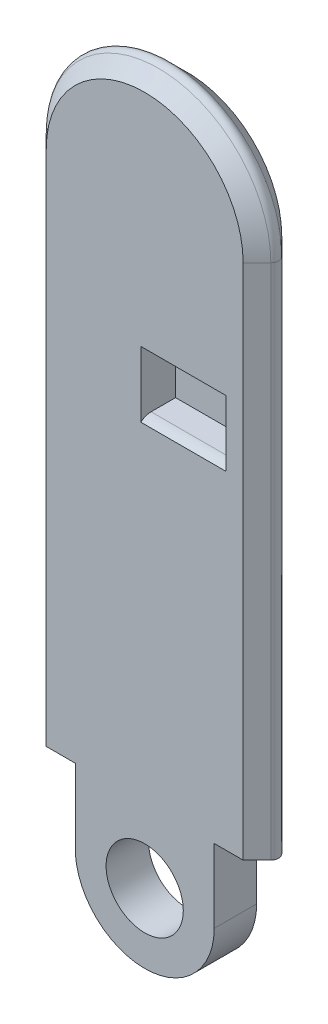
ISO-10303-21;
HEADER;
FILE_DESCRIPTION(('STEP AP214'),'2;1');
FILE_NAME('part.step','',(''),(''),'','','');
FILE_SCHEMA(('AUTOMOTIVE_DESIGN { 1 0 10303 214 1 1 1 1 }'));
ENDSEC;
DATA;
#1=APPLICATION_CONTEXT('core data for automotive mechanical design processes');
#2=APPLICATION_PROTOCOL_DEFINITION('international standard','automotive_design',2000,#1);
#3=PRODUCT_CONTEXT('',#1,'mechanical');
#4=PRODUCT('Part','Part','',(#3));
#5=PRODUCT_RELATED_PRODUCT_CATEGORY('part','',(#4));
#6=PRODUCT_DEFINITION_FORMATION('','',#4);
#7=PRODUCT_DEFINITION_CONTEXT('part definition',#1,'design');
#8=PRODUCT_DEFINITION('design','',#6,#7);
#9=PRODUCT_DEFINITION_SHAPE('','',#8);
#10=(LENGTH_UNIT() NAMED_UNIT(*) SI_UNIT(.MILLI.,.METRE.));
#11=(NAMED_UNIT(*) PLANE_ANGLE_UNIT() SI_UNIT($,.RADIAN.));
#12=(NAMED_UNIT(*) SI_UNIT($,.STERADIAN.) SOLID_ANGLE_UNIT());
#13=UNCERTAINTY_MEASURE_WITH_UNIT(LENGTH_MEASURE(1.E-05),#10,'distance_accuracy_value','');
#14=(GEOMETRIC_REPRESENTATION_CONTEXT(3) GLOBAL_UNCERTAINTY_ASSIGNED_CONTEXT((#13)) GLOBAL_UNIT_ASSIGNED_CONTEXT((#10,
#11,#12)) REPRESENTATION_CONTEXT('',''));
#15=CARTESIAN_POINT('',(0.,0.,0.));
#16=DIRECTION('',(0.,0.,1.));
#17=DIRECTION('',(1.,0.,0.));
#18=AXIS2_PLACEMENT_3D('',#15,#16,#17);
#19=CARTESIAN_POINT('',(0.,-33.5,-6.));
#20=DIRECTION('',(0.,-1.,0.));
#21=DIRECTION('',(0.,0.,-1.));
#22=AXIS2_PLACEMENT_3D('',#19,#20,#21);
#23=PLANE('',#22);
#24=DIRECTION('',(0.,0.,1.));
#25=VECTOR('',#24,1.);
#26=CARTESIAN_POINT('',(-8.97468464942043,-33.5,-6.));
#27=LINE('',#26,#25);
#28=CARTESIAN_POINT('',(-8.97468464942043,-33.5,-6.));
#29=VERTEX_POINT('',#28);
#30=CARTESIAN_POINT('',(-8.97468464942043,-33.5,-0.5));
#31=VERTEX_POINT('',#30);
#32=EDGE_CURVE('E425',#29,#31,#27,.T.);
#33=ORIENTED_EDGE('',*,*,#32,.T.);
#34=DIRECTION('',(-1.,0.,0.));
#35=VECTOR('',#34,1.);
#36=CARTESIAN_POINT('',(0.,-33.5,-0.5));
#37=LINE('',#36,#35);
#38=CARTESIAN_POINT('',(-12.75,-33.5,-0.5));
#39=VERTEX_POINT('',#38);
#40=EDGE_CURVE('E60',#31,#39,#37,.T.);
#41=ORIENTED_EDGE('',*,*,#40,.T.);
#42=DIRECTION('',(0.707106781186546,0.,0.707106781186549));
#43=VECTOR('',#42,1.);
#44=CARTESIAN_POINT('',(-9.12500000000002,-33.5,3.12499999999998));
#45=LINE('',#44,#43);
#46=CARTESIAN_POINT('',(-14.5428932188134,-33.5,-2.29289321881345));
#47=VERTEX_POINT('',#46);
#48=EDGE_CURVE('E329',#39,#47,#45,.F.);
#49=ORIENTED_EDGE('',*,*,#48,.T.);
#50=CARTESIAN_POINT('',(-13.8357864376269,-33.5,-3.));
#51=DIRECTION('',(0.,-1.,0.));
#52=DIRECTION('',(0.,0.,-1.));
#53=AXIS2_PLACEMENT_3D('',#50,#51,#52);
#54=CIRCLE('',#53,1.);
#55=CARTESIAN_POINT('',(-14.5428932188134,-33.5,-3.70710678118655));
#56=VERTEX_POINT('',#55);
#57=EDGE_CURVE('E304',#47,#56,#54,.T.);
#58=ORIENTED_EDGE('',*,*,#57,.T.);
#59=DIRECTION('',(0.707106781186548,0.,-0.707106781186548));
#60=VECTOR('',#59,1.);
#61=CARTESIAN_POINT('',(-6.12499999999999,-33.5,-12.125));
#62=LINE('',#61,#60);
#63=CARTESIAN_POINT('',(-12.25,-33.5,-6.));
#64=VERTEX_POINT('',#63);
#65=EDGE_CURVE('E327',#56,#64,#62,.T.);
#66=ORIENTED_EDGE('',*,*,#65,.T.);
#67=DIRECTION('',(1.,0.,0.));
#68=VECTOR('',#67,1.);
#69=CARTESIAN_POINT('',(0.,-33.5,-6.));
#70=LINE('',#69,#68);
#71=EDGE_CURVE('E338',#64,#29,#70,.T.);
#72=ORIENTED_EDGE('',*,*,#71,.T.);
#73=EDGE_LOOP('',(#33,#41,#49,#58,#66,#72));
#74=FACE_BOUND('',#73,.T.);
#75=ADVANCED_FACE('F45',(#74),#23,.T.);
#76=DIRECTION('',(-0.707106781186546,0.,0.707106781186549));
#77=VECTOR('',#76,1.);
#78=CARTESIAN_POINT('',(9.12500000000002,-33.5,3.12499999999999));
#79=LINE('',#78,#77);
#80=CARTESIAN_POINT('',(14.5428932188134,-33.5,-2.29289321881345));
#81=VERTEX_POINT('',#80);
#82=CARTESIAN_POINT('',(12.75,-33.5,-0.5));
#83=VERTEX_POINT('',#82);
#84=EDGE_CURVE('E324',#81,#83,#79,.T.);
#85=ORIENTED_EDGE('',*,*,#84,.T.);
#86=DIRECTION('',(-1.,0.,0.));
#87=VECTOR('',#86,1.);
#88=CARTESIAN_POINT('',(0.,-33.5,-0.5));
#89=LINE('',#88,#87);
#90=CARTESIAN_POINT('',(9.,-33.5,-0.5));
#91=VERTEX_POINT('',#90);
#92=EDGE_CURVE('E489',#83,#91,#89,.T.);
#93=ORIENTED_EDGE('',*,*,#92,.T.);
#94=DIRECTION('',(0.,0.,1.));
#95=VECTOR('',#94,1.);
#96=CARTESIAN_POINT('',(9.00000000000001,-33.5,-6.));
#97=LINE('',#96,#95);
#98=CARTESIAN_POINT('',(9.00000000000001,-33.5,-6.));
#99=VERTEX_POINT('',#98);
#100=EDGE_CURVE('E391',#99,#91,#97,.T.);
#101=ORIENTED_EDGE('',*,*,#100,.F.);
#102=CARTESIAN_POINT('',(12.25,-33.5,-6.));
#103=VERTEX_POINT('',#102);
#104=EDGE_CURVE('E313',#99,#103,#70,.T.);
#105=ORIENTED_EDGE('',*,*,#104,.T.);
#106=DIRECTION('',(-0.707106781186548,0.,-0.707106781186548));
#107=VECTOR('',#106,1.);
#108=CARTESIAN_POINT('',(6.12499999999999,-33.5,-12.125));
#109=LINE('',#108,#107);
#110=CARTESIAN_POINT('',(14.5428932188134,-33.5,-3.70710678118654));
#111=VERTEX_POINT('',#110);
#112=EDGE_CURVE('E309',#103,#111,#109,.F.);
#113=ORIENTED_EDGE('',*,*,#112,.T.);
#114=CARTESIAN_POINT('',(13.8357864376269,-33.5,-3.));
#115=DIRECTION('',(0.,-1.,0.));
#116=DIRECTION('',(0.,0.,-1.));
#117=AXIS2_PLACEMENT_3D('',#114,#115,#116);
#118=CIRCLE('',#117,1.);
#119=EDGE_CURVE('E302',#111,#81,#118,.T.);
#120=ORIENTED_EDGE('',*,*,#119,.T.);
#121=EDGE_LOOP('',(#85,#93,#101,#105,#113,#120));
#122=FACE_BOUND('',#121,.T.);
#123=ADVANCED_FACE('F533',(#122),#23,.T.);
#124=CARTESIAN_POINT('',(-12.25,0.,0.));
#125=DIRECTION('',(0.707106781186549,0.,-0.707106781186546));
#126=DIRECTION('',(0.,-1.,0.));
#127=AXIS2_PLACEMENT_3D('',#124,#125,#126);
#128=PLANE('',#127);
#129=ORIENTED_EDGE('',*,*,#48,.F.);
#130=DIRECTION('',(0.,-1.,0.));
#131=VECTOR('',#130,1.);
#132=CARTESIAN_POINT('',(-12.75,0.,-0.5));
#133=LINE('',#132,#131);
#134=CARTESIAN_POINT('',(-12.75,33.5,-0.5));
#135=VERTEX_POINT('',#134);
#136=EDGE_CURVE('E470',#39,#135,#133,.F.);
#137=ORIENTED_EDGE('',*,*,#136,.T.);
#138=DIRECTION('',(0.707106781186546,0.,0.707106781186549));
#139=VECTOR('',#138,1.);
#140=CARTESIAN_POINT('',(-15.75,33.5,-3.50000000000002));
#141=LINE('',#140,#139);
#142=CARTESIAN_POINT('',(-14.5428932188134,33.5,-2.29289321881345));
#143=VERTEX_POINT('',#142);
#144=EDGE_CURVE('E310',#143,#135,#141,.T.);
#145=ORIENTED_EDGE('',*,*,#144,.F.);
#146=DIRECTION('',(0.,1.,0.));
#147=VECTOR('',#146,1.);
#148=CARTESIAN_POINT('',(-14.5428932188134,0.,-2.29289321881345));
#149=LINE('',#148,#147);
#150=EDGE_CURVE('E283',#143,#47,#149,.F.);
#151=ORIENTED_EDGE('',*,*,#150,.T.);
#152=EDGE_LOOP('',(#129,#137,#145,#151));
#153=FACE_BOUND('',#152,.T.);
#154=ADVANCED_FACE('F539',(#153),#128,.F.);
#155=CARTESIAN_POINT('',(0.,33.5,0.));
#156=DIRECTION('',(0.,0.,-1.));
#157=DIRECTION('',(-1.,0.,0.));
#158=AXIS2_PLACEMENT_3D('',#155,#156,#157);
#159=CONICAL_SURFACE('',#158,12.25,0.785398163397446);
#160=ORIENTED_EDGE('',*,*,#144,.T.);
#161=CARTESIAN_POINT('',(0.,33.5,-0.5));
#162=DIRECTION('',(0.,0.,1.));
#163=DIRECTION('',(1.,0.,0.));
#164=AXIS2_PLACEMENT_3D('',#161,#162,#163);
#165=CIRCLE('',#164,12.75);
#166=CARTESIAN_POINT('',(12.75,33.5,-0.5));
#167=VERTEX_POINT('',#166);
#168=EDGE_CURVE('E482',#135,#167,#165,.F.);
#169=ORIENTED_EDGE('',*,*,#168,.T.);
#170=DIRECTION('',(-0.707106781186546,0.,0.707106781186549));
#171=VECTOR('',#170,1.);
#172=CARTESIAN_POINT('',(15.75,33.5,-3.50000000000002));
#173=LINE('',#172,#171);
#174=CARTESIAN_POINT('',(14.5428932188134,33.5,-2.29289321881345));
#175=VERTEX_POINT('',#174);
#176=EDGE_CURVE('E314',#175,#167,#173,.T.);
#177=ORIENTED_EDGE('',*,*,#176,.F.);
#178=CARTESIAN_POINT('',(0.,33.5,-2.29289321881345));
#179=DIRECTION('',(0.,0.,1.));
#180=DIRECTION('',(1.,0.,0.));
#181=AXIS2_PLACEMENT_3D('',#178,#179,#180);
#182=CIRCLE('',#181,14.5428932188134);
#183=EDGE_CURVE('E296',#175,#143,#182,.T.);
#184=ORIENTED_EDGE('',*,*,#183,.T.);
#185=EDGE_LOOP('',(#160,#169,#177,#184));
#186=FACE_BOUND('',#185,.T.);
#187=ADVANCED_FACE('F568',(#186),#159,.T.);
#188=CARTESIAN_POINT('',(15.75,0.,-3.50000000000002));
#189=DIRECTION('',(0.707106781186549,0.,0.707106781186546));
#190=DIRECTION('',(0.,1.,0.));
#191=AXIS2_PLACEMENT_3D('',#188,#189,#190);
#192=PLANE('',#191);
#193=ORIENTED_EDGE('',*,*,#176,.T.);
#194=DIRECTION('',(0.,-1.,0.));
#195=VECTOR('',#194,1.);
#196=CARTESIAN_POINT('',(12.75,0.,-0.5));
#197=LINE('',#196,#195);
#198=EDGE_CURVE('E485',#167,#83,#197,.T.);
#199=ORIENTED_EDGE('',*,*,#198,.T.);
#200=ORIENTED_EDGE('',*,*,#84,.F.);
#201=DIRECTION('',(0.,1.,0.));
#202=VECTOR('',#201,1.);
#203=CARTESIAN_POINT('',(14.5428932188134,0.,-2.29289321881345));
#204=LINE('',#203,#202);
#205=EDGE_CURVE('E300',#81,#175,#204,.T.);
#206=ORIENTED_EDGE('',*,*,#205,.T.);
#207=EDGE_LOOP('',(#193,#199,#200,#206));
#208=FACE_BOUND('',#207,.T.);
#209=ADVANCED_FACE('F561',(#208),#192,.T.);
#210=CARTESIAN_POINT('',(9.,0.,-6.));
#211=DIRECTION('',(1.,0.,0.));
#212=DIRECTION('',(0.,1.,0.));
#213=AXIS2_PLACEMENT_3D('',#210,#211,#212);
#214=PLANE('',#213);
#215=ORIENTED_EDGE('',*,*,#100,.T.);
#216=DIRECTION('',(0.,-1.,0.));
#217=VECTOR('',#216,1.);
#218=CARTESIAN_POINT('',(9.,0.,-0.5));
#219=LINE('',#218,#217);
#220=CARTESIAN_POINT('',(9.00000000000001,-43.030823628885,-0.5));
#221=VERTEX_POINT('',#220);
#222=EDGE_CURVE('E492',#91,#221,#219,.T.);
#223=ORIENTED_EDGE('',*,*,#222,.T.);
#224=DIRECTION('',(0.,0.,1.));
#225=VECTOR('',#224,1.);
#226=CARTESIAN_POINT('',(9.00000000000001,-43.030823628885,-6.));
#227=LINE('',#226,#225);
#228=CARTESIAN_POINT('',(9.00000000000001,-43.030823628885,-6.));
#229=VERTEX_POINT('',#228);
#230=EDGE_CURVE('E432',#229,#221,#227,.T.);
#231=ORIENTED_EDGE('',*,*,#230,.F.);
#232=DIRECTION('',(0.,1.,0.));
#233=VECTOR('',#232,1.);
#234=CARTESIAN_POINT('',(9.,0.,-6.));
#235=LINE('',#234,#233);
#236=EDGE_CURVE('E439',#229,#99,#235,.T.);
#237=ORIENTED_EDGE('',*,*,#236,.T.);
#238=EDGE_LOOP('',(#215,#223,#231,#237));
#239=FACE_BOUND('',#238,.T.);
#240=ADVANCED_FACE('F567',(#239),#214,.T.);
#241=CARTESIAN_POINT('',(0.,-43.030823628885,-6.));
#242=DIRECTION('',(0.,0.,1.));
#243=DIRECTION('',(1.,0.,0.));
#244=AXIS2_PLACEMENT_3D('',#241,#242,#243);
#245=CYLINDRICAL_SURFACE('',#244,9.);
#246=ORIENTED_EDGE('',*,*,#230,.T.);
#247=CARTESIAN_POINT('',(0.,-43.030823628885,-0.5));
#248=DIRECTION('',(0.,0.,1.));
#249=DIRECTION('',(1.,0.,0.));
#250=AXIS2_PLACEMENT_3D('',#247,#248,#249);
#251=CIRCLE('',#250,9.);
#252=CARTESIAN_POINT('',(-8.97468464942043,-43.7053867789735,-0.5));
#253=VERTEX_POINT('',#252);
#254=EDGE_CURVE('E495',#221,#253,#251,.F.);
#255=ORIENTED_EDGE('',*,*,#254,.T.);
#256=DIRECTION('',(0.,0.,1.));
#257=VECTOR('',#256,1.);
#258=CARTESIAN_POINT('',(-8.97468464942043,-43.7053867789735,-6.));
#259=LINE('',#258,#257);
#260=CARTESIAN_POINT('',(-8.97468464942043,-43.7053867789735,-6.));
#261=VERTEX_POINT('',#260);
#262=EDGE_CURVE('E428',#261,#253,#259,.T.);
#263=ORIENTED_EDGE('',*,*,#262,.F.);
#264=CARTESIAN_POINT('',(0.,-43.030823628885,-6.));
#265=DIRECTION('',(0.,0.,1.));
#266=DIRECTION('',(1.,0.,0.));
#267=AXIS2_PLACEMENT_3D('',#264,#265,#266);
#268=CIRCLE('',#267,9.);
#269=EDGE_CURVE('E441',#261,#229,#268,.T.);
#270=ORIENTED_EDGE('',*,*,#269,.T.);
#271=EDGE_LOOP('',(#246,#255,#263,#270));
#272=FACE_BOUND('',#271,.T.);
#273=ADVANCED_FACE('F664',(#272),#245,.T.);
#274=CARTESIAN_POINT('',(-8.97468464942044,0.,-6.));
#275=DIRECTION('',(-1.,0.,0.));
#276=DIRECTION('',(0.,-1.,0.));
#277=AXIS2_PLACEMENT_3D('',#274,#275,#276);
#278=PLANE('',#277);
#279=ORIENTED_EDGE('',*,*,#262,.T.);
#280=DIRECTION('',(0.,1.,0.));
#281=VECTOR('',#280,1.);
#282=CARTESIAN_POINT('',(-8.97468464942044,0.,-0.5));
#283=LINE('',#282,#281);
#284=EDGE_CURVE('E498',#253,#31,#283,.T.);
#285=ORIENTED_EDGE('',*,*,#284,.T.);
#286=ORIENTED_EDGE('',*,*,#32,.F.);
#287=DIRECTION('',(0.,-1.,0.));
#288=VECTOR('',#287,1.);
#289=CARTESIAN_POINT('',(-8.97468464942044,0.,-6.));
#290=LINE('',#289,#288);
#291=EDGE_CURVE('E444',#29,#261,#290,.T.);
#292=ORIENTED_EDGE('',*,*,#291,.T.);
#293=EDGE_LOOP('',(#279,#285,#286,#292));
#294=FACE_BOUND('',#293,.T.);
#295=ADVANCED_FACE('F660',(#294),#278,.T.);
#296=CARTESIAN_POINT('',(0.,-43.030823628885,-6.));
#297=DIRECTION('',(0.,0.,1.));
#298=DIRECTION('',(1.,0.,0.));
#299=AXIS2_PLACEMENT_3D('',#296,#297,#298);
#300=CYLINDRICAL_SURFACE('',#299,5.);
#301=CARTESIAN_POINT('',(0.,-43.030823628885,-6.));
#302=DIRECTION('',(0.,0.,1.));
#303=DIRECTION('',(1.,0.,0.));
#304=AXIS2_PLACEMENT_3D('',#301,#302,#303);
#305=CIRCLE('',#304,5.);
#306=CARTESIAN_POINT('',(5.,-43.030823628885,-6.));
#307=VERTEX_POINT('',#306);
#308=EDGE_CURVE('E429',#307,#307,#305,.T.);
#309=ORIENTED_EDGE('',*,*,#308,.F.);
#310=EDGE_LOOP('',(#309));
#311=FACE_BOUND('',#310,.T.);
#312=CARTESIAN_POINT('',(0.,-43.030823628885,-0.5));
#313=DIRECTION('',(0.,0.,1.));
#314=DIRECTION('',(1.,0.,0.));
#315=AXIS2_PLACEMENT_3D('',#312,#313,#314);
#316=CIRCLE('',#315,5.);
#317=CARTESIAN_POINT('',(5.,-43.030823628885,-0.5));
#318=VERTEX_POINT('',#317);
#319=EDGE_CURVE('E500',#318,#318,#316,.F.);
#320=ORIENTED_EDGE('',*,*,#319,.F.);
#321=EDGE_LOOP('',(#320));
#322=FACE_BOUND('',#321,.T.);
#323=ADVANCED_FACE('F663',(#311,#322),#300,.F.);
#324=CARTESIAN_POINT('',(0.,0.,-6.));
#325=DIRECTION('',(0.,0.,1.));
#326=DIRECTION('',(1.,0.,0.));
#327=AXIS2_PLACEMENT_3D('',#324,#325,#326);
#328=PLANE('',#327);
#329=ORIENTED_EDGE('',*,*,#308,.T.);
#330=EDGE_LOOP('',(#329));
#331=FACE_BOUND('',#330,.T.);
#332=CARTESIAN_POINT('',(0.,33.5,-6.));
#333=DIRECTION('',(0.,0.,1.));
#334=DIRECTION('',(1.,0.,0.));
#335=AXIS2_PLACEMENT_3D('',#332,#333,#334);
#336=CIRCLE('',#335,12.25);
#337=CARTESIAN_POINT('',(-12.25,33.5,-6.));
#338=VERTEX_POINT('',#337);
#339=CARTESIAN_POINT('',(12.25,33.5,-6.));
#340=VERTEX_POINT('',#339);
#341=EDGE_CURVE('E334',#338,#340,#336,.F.);
#342=ORIENTED_EDGE('',*,*,#341,.T.);
#343=DIRECTION('',(0.,-1.,0.));
#344=VECTOR('',#343,1.);
#345=CARTESIAN_POINT('',(12.25,0.,-6.));
#346=LINE('',#345,#344);
#347=EDGE_CURVE('E331',#340,#103,#346,.T.);
#348=ORIENTED_EDGE('',*,*,#347,.T.);
#349=ORIENTED_EDGE('',*,*,#104,.F.);
#350=ORIENTED_EDGE('',*,*,#236,.F.);
#351=ORIENTED_EDGE('',*,*,#269,.F.);
#352=ORIENTED_EDGE('',*,*,#291,.F.);
#353=ORIENTED_EDGE('',*,*,#71,.F.);
#354=DIRECTION('',(0.,1.,0.));
#355=VECTOR('',#354,1.);
#356=CARTESIAN_POINT('',(-12.25,33.5,-6.));
#357=LINE('',#356,#355);
#358=EDGE_CURVE('E336',#64,#338,#357,.T.);
#359=ORIENTED_EDGE('',*,*,#358,.T.);
#360=EDGE_LOOP('',(#342,#348,#349,#350,#351,#352,#353,#359));
#361=FACE_BOUND('',#360,.T.);
#362=DIRECTION('',(1.,0.,0.));
#363=VECTOR('',#362,1.);
#364=CARTESIAN_POINT('',(-1.5,1.26113266364835,-6.));
#365=LINE('',#364,#363);
#366=CARTESIAN_POINT('',(-10.5,1.26113266364835,-6.));
#367=VERTEX_POINT('',#366);
#368=CARTESIAN_POINT('',(-1.5,1.26113266364835,-6.));
#369=VERTEX_POINT('',#368);
#370=EDGE_CURVE('E380',#367,#369,#365,.T.);
#371=ORIENTED_EDGE('',*,*,#370,.F.);
#372=DIRECTION('',(0.,1.,0.));
#373=VECTOR('',#372,1.);
#374=CARTESIAN_POINT('',(-10.5,-5.23886733635165,-6.));
#375=LINE('',#374,#373);
#376=CARTESIAN_POINT('',(-10.5,-5.23886733635165,-6.));
#377=VERTEX_POINT('',#376);
#378=EDGE_CURVE('E377',#377,#367,#375,.T.);
#379=ORIENTED_EDGE('',*,*,#378,.F.);
#380=DIRECTION('',(-1.,0.,0.));
#381=VECTOR('',#380,1.);
#382=CARTESIAN_POINT('',(-1.5,-5.23886733635165,-6.));
#383=LINE('',#382,#381);
#384=CARTESIAN_POINT('',(-1.5,-5.23886733635165,-6.));
#385=VERTEX_POINT('',#384);
#386=EDGE_CURVE('E366',#385,#377,#383,.T.);
#387=ORIENTED_EDGE('',*,*,#386,.F.);
#388=DIRECTION('',(0.,-1.,0.));
#389=VECTOR('',#388,1.);
#390=CARTESIAN_POINT('',(-1.5,-5.23886733635165,-6.));
#391=LINE('',#390,#389);
#392=EDGE_CURVE('E383',#369,#385,#391,.T.);
#393=ORIENTED_EDGE('',*,*,#392,.F.);
#394=EDGE_LOOP('',(#371,#379,#387,#393));
#395=FACE_BOUND('',#394,.T.);
#396=DIRECTION('',(0.,-1.,0.));
#397=VECTOR('',#396,1.);
#398=CARTESIAN_POINT('',(-1.5,-31.2388673363516,-6.));
#399=LINE('',#398,#397);
#400=CARTESIAN_POINT('',(-1.5,-24.2388673363516,-6.));
#401=VERTEX_POINT('',#400);
#402=CARTESIAN_POINT('',(-1.5,-31.2388673363516,-6.));
#403=VERTEX_POINT('',#402);
#404=EDGE_CURVE('E411',#401,#403,#399,.T.);
#405=ORIENTED_EDGE('',*,*,#404,.F.);
#406=DIRECTION('',(-1.,0.,0.));
#407=VECTOR('',#406,1.);
#408=CARTESIAN_POINT('',(0.,-24.2388673363516,-6.));
#409=LINE('',#408,#407);
#410=CARTESIAN_POINT('',(-10.5,-24.2388673363516,-6.));
#411=VERTEX_POINT('',#410);
#412=EDGE_CURVE('E277',#401,#411,#409,.T.);
#413=ORIENTED_EDGE('',*,*,#412,.T.);
#414=DIRECTION('',(0.,1.,0.));
#415=VECTOR('',#414,1.);
#416=CARTESIAN_POINT('',(-10.5,-31.2388673363516,-6.));
#417=LINE('',#416,#415);
#418=CARTESIAN_POINT('',(-10.5,-31.2388673363516,-6.));
#419=VERTEX_POINT('',#418);
#420=EDGE_CURVE('E379',#419,#411,#417,.T.);
#421=ORIENTED_EDGE('',*,*,#420,.F.);
#422=DIRECTION('',(-1.,0.,0.));
#423=VECTOR('',#422,1.);
#424=CARTESIAN_POINT('',(-1.5,-31.2388673363516,-6.));
#425=LINE('',#424,#423);
#426=EDGE_CURVE('E407',#403,#419,#425,.T.);
#427=ORIENTED_EDGE('',*,*,#426,.F.);
#428=EDGE_LOOP('',(#405,#413,#421,#427));
#429=FACE_BOUND('',#428,.T.);
#430=DIRECTION('',(1.,0.,0.));
#431=VECTOR('',#430,1.);
#432=CARTESIAN_POINT('',(0.,15.,-6.));
#433=LINE('',#432,#431);
#434=CARTESIAN_POINT('',(0.500000000000004,15.,-6.));
#435=VERTEX_POINT('',#434);
#436=CARTESIAN_POINT('',(4.5,15.,-6.));
#437=VERTEX_POINT('',#436);
#438=EDGE_CURVE('E467',#435,#437,#433,.T.);
#439=ORIENTED_EDGE('',*,*,#438,.F.);
#440=DIRECTION('',(0.,-1.,0.));
#441=VECTOR('',#440,1.);
#442=CARTESIAN_POINT('',(0.500000000000004,0.,-6.));
#443=LINE('',#442,#441);
#444=CARTESIAN_POINT('',(0.500000000000004,8.99999999999999,-6.));
#445=VERTEX_POINT('',#444);
#446=EDGE_CURVE('E457',#435,#445,#443,.T.);
#447=ORIENTED_EDGE('',*,*,#446,.T.);
#448=DIRECTION('',(1.,0.,0.));
#449=VECTOR('',#448,1.);
#450=CARTESIAN_POINT('',(0.,8.99999999999999,-6.));
#451=LINE('',#450,#449);
#452=CARTESIAN_POINT('',(4.5,8.99999999999999,-6.));
#453=VERTEX_POINT('',#452);
#454=EDGE_CURVE('E461',#445,#453,#451,.T.);
#455=ORIENTED_EDGE('',*,*,#454,.T.);
#456=DIRECTION('',(0.,-1.,0.));
#457=VECTOR('',#456,1.);
#458=CARTESIAN_POINT('',(4.5,0.,-6.));
#459=LINE('',#458,#457);
#460=EDGE_CURVE('E464',#437,#453,#459,.T.);
#461=ORIENTED_EDGE('',*,*,#460,.F.);
#462=EDGE_LOOP('',(#439,#447,#455,#461));
#463=FACE_BOUND('',#462,.T.);
#464=ADVANCED_FACE('F542',(#331,#361,#395,#429,#463),#328,.F.);
#465=CARTESIAN_POINT('',(-15.75,0.,-2.49999999999998));
#466=DIRECTION('',(-0.707106781186548,0.,-0.707106781186548));
#467=DIRECTION('',(0.,1.,0.));
#468=AXIS2_PLACEMENT_3D('',#465,#466,#467);
#469=PLANE('',#468);
#470=ORIENTED_EDGE('',*,*,#65,.F.);
#471=DIRECTION('',(0.,-1.,0.));
#472=VECTOR('',#471,1.);
#473=CARTESIAN_POINT('',(-14.5428932188134,0.,-3.70710678118654));
#474=LINE('',#473,#472);
#475=CARTESIAN_POINT('',(-14.5428932188134,33.5,-3.70710678118654));
#476=VERTEX_POINT('',#475);
#477=EDGE_CURVE('E294',#56,#476,#474,.F.);
#478=ORIENTED_EDGE('',*,*,#477,.T.);
#479=DIRECTION('',(-0.707106781186548,0.,0.707106781186548));
#480=VECTOR('',#479,1.);
#481=CARTESIAN_POINT('',(-12.25,33.5,-6.));
#482=LINE('',#481,#480);
#483=EDGE_CURVE('E317',#338,#476,#482,.T.);
#484=ORIENTED_EDGE('',*,*,#483,.F.);
#485=ORIENTED_EDGE('',*,*,#358,.F.);
#486=EDGE_LOOP('',(#470,#478,#484,#485));
#487=FACE_BOUND('',#486,.T.);
#488=ADVANCED_FACE('F559',(#487),#469,.T.);
#489=CARTESIAN_POINT('',(0.,33.5,-2.49999999999998));
#490=DIRECTION('',(0.,0.,1.));
#491=DIRECTION('',(1.,0.,0.));
#492=AXIS2_PLACEMENT_3D('',#489,#490,#491);
#493=CONICAL_SURFACE('',#492,15.75,0.785398163397448);
#494=ORIENTED_EDGE('',*,*,#483,.T.);
#495=CARTESIAN_POINT('',(0.,33.5,-3.70710678118655));
#496=DIRECTION('',(0.,0.,-1.));
#497=DIRECTION('',(-1.,0.,0.));
#498=AXIS2_PLACEMENT_3D('',#495,#496,#497);
#499=CIRCLE('',#498,14.5428932188134);
#500=CARTESIAN_POINT('',(14.5428932188134,33.5,-3.70710678118655));
#501=VERTEX_POINT('',#500);
#502=EDGE_CURVE('E298',#476,#501,#499,.T.);
#503=ORIENTED_EDGE('',*,*,#502,.T.);
#504=DIRECTION('',(0.707106781186548,0.,0.707106781186548));
#505=VECTOR('',#504,1.);
#506=CARTESIAN_POINT('',(12.25,33.5,-6.));
#507=LINE('',#506,#505);
#508=EDGE_CURVE('E287',#340,#501,#507,.T.);
#509=ORIENTED_EDGE('',*,*,#508,.F.);
#510=ORIENTED_EDGE('',*,*,#341,.F.);
#511=EDGE_LOOP('',(#494,#503,#509,#510));
#512=FACE_BOUND('',#511,.T.);
#513=ADVANCED_FACE('F552',(#512),#493,.T.);
#514=CARTESIAN_POINT('',(12.25,0.,-6.));
#515=DIRECTION('',(-0.707106781186548,0.,0.707106781186548));
#516=DIRECTION('',(0.,-1.,0.));
#517=AXIS2_PLACEMENT_3D('',#514,#515,#516);
#518=PLANE('',#517);
#519=ORIENTED_EDGE('',*,*,#508,.T.);
#520=DIRECTION('',(0.,-1.,0.));
#521=VECTOR('',#520,1.);
#522=CARTESIAN_POINT('',(14.5428932188134,0.,-3.70710678118654));
#523=LINE('',#522,#521);
#524=EDGE_CURVE('E306',#501,#111,#523,.T.);
#525=ORIENTED_EDGE('',*,*,#524,.T.);
#526=ORIENTED_EDGE('',*,*,#112,.F.);
#527=ORIENTED_EDGE('',*,*,#347,.F.);
#528=EDGE_LOOP('',(#519,#525,#526,#527));
#529=FACE_BOUND('',#528,.T.);
#530=ADVANCED_FACE('F544',(#529),#518,.F.);
#531=CARTESIAN_POINT('',(-13.8357864376269,0.,-3.));
#532=DIRECTION('',(0.,-1.,0.));
#533=DIRECTION('',(1.,0.,0.));
#534=AXIS2_PLACEMENT_3D('',#531,#532,#533);
#535=CYLINDRICAL_SURFACE('',#534,1.);
#536=ORIENTED_EDGE('',*,*,#57,.F.);
#537=ORIENTED_EDGE('',*,*,#150,.F.);
#538=CARTESIAN_POINT('',(-13.8357864376269,33.5,-3.));
#539=DIRECTION('',(0.,1.,0.));
#540=DIRECTION('',(0.,0.,1.));
#541=AXIS2_PLACEMENT_3D('',#538,#539,#540);
#542=CIRCLE('',#541,1.);
#543=EDGE_CURVE('E284',#476,#143,#542,.T.);
#544=ORIENTED_EDGE('',*,*,#543,.F.);
#545=ORIENTED_EDGE('',*,*,#477,.F.);
#546=EDGE_LOOP('',(#536,#537,#544,#545));
#547=FACE_BOUND('',#546,.T.);
#548=ADVANCED_FACE('F551',(#547),#535,.T.);
#549=CARTESIAN_POINT('',(0.,33.5,-3.));
#550=DIRECTION('',(0.,0.,1.));
#551=DIRECTION('',(1.,0.,0.));
#552=AXIS2_PLACEMENT_3D('',#549,#550,#551);
#553=TOROIDAL_SURFACE('',#552,13.8357864376269,1.);
#554=ORIENTED_EDGE('',*,*,#543,.T.);
#555=ORIENTED_EDGE('',*,*,#183,.F.);
#556=CARTESIAN_POINT('',(13.8357864376269,33.5,-3.));
#557=DIRECTION('',(0.,-1.,0.));
#558=DIRECTION('',(0.,0.,-1.));
#559=AXIS2_PLACEMENT_3D('',#556,#557,#558);
#560=CIRCLE('',#559,1.);
#561=EDGE_CURVE('E288',#501,#175,#560,.T.);
#562=ORIENTED_EDGE('',*,*,#561,.F.);
#563=ORIENTED_EDGE('',*,*,#502,.F.);
#564=EDGE_LOOP('',(#554,#555,#562,#563));
#565=FACE_BOUND('',#564,.T.);
#566=ADVANCED_FACE('F591',(#565),#553,.T.);
#567=CARTESIAN_POINT('',(13.8357864376269,0.,-3.));
#568=DIRECTION('',(0.,1.,0.));
#569=DIRECTION('',(-1.,0.,0.));
#570=AXIS2_PLACEMENT_3D('',#567,#568,#569);
#571=CYLINDRICAL_SURFACE('',#570,1.);
#572=ORIENTED_EDGE('',*,*,#561,.T.);
#573=ORIENTED_EDGE('',*,*,#205,.F.);
#574=ORIENTED_EDGE('',*,*,#119,.F.);
#575=ORIENTED_EDGE('',*,*,#524,.F.);
#576=EDGE_LOOP('',(#572,#573,#574,#575));
#577=FACE_BOUND('',#576,.T.);
#578=ADVANCED_FACE('F587',(#577),#571,.T.);
#579=CARTESIAN_POINT('',(-10.5,-5.23886733635165,-1.5));
#580=DIRECTION('',(-1.,0.,0.));
#581=DIRECTION('',(0.,0.,1.));
#582=AXIS2_PLACEMENT_3D('',#579,#580,#581);
#583=PLANE('',#582);
#584=ORIENTED_EDGE('',*,*,#378,.T.);
#585=DIRECTION('',(0.,0.,-1.));
#586=VECTOR('',#585,1.);
#587=CARTESIAN_POINT('',(-10.5,1.26113266364835,-1.5));
#588=LINE('',#587,#586);
#589=CARTESIAN_POINT('',(-10.5,1.26113266364835,-1.5));
#590=VERTEX_POINT('',#589);
#591=EDGE_CURVE('E376',#590,#367,#588,.T.);
#592=ORIENTED_EDGE('',*,*,#591,.F.);
#593=DIRECTION('',(0.,1.,0.));
#594=VECTOR('',#593,1.);
#595=CARTESIAN_POINT('',(-10.5,-5.23886733635165,-1.5));
#596=LINE('',#595,#594);
#597=CARTESIAN_POINT('',(-10.5,-5.23886733635165,-1.5));
#598=VERTEX_POINT('',#597);
#599=EDGE_CURVE('E363',#598,#590,#596,.T.);
#600=ORIENTED_EDGE('',*,*,#599,.F.);
#601=DIRECTION('',(0.,0.,-1.));
#602=VECTOR('',#601,1.);
#603=CARTESIAN_POINT('',(-10.5,-5.23886733635165,-1.5));
#604=LINE('',#603,#602);
#605=EDGE_CURVE('E388',#598,#377,#604,.T.);
#606=ORIENTED_EDGE('',*,*,#605,.T.);
#607=EDGE_LOOP('',(#584,#592,#600,#606));
#608=FACE_BOUND('',#607,.T.);
#609=ADVANCED_FACE('F590',(#608),#583,.F.);
#610=CARTESIAN_POINT('',(-1.5,-5.23886733635165,-1.5));
#611=DIRECTION('',(0.,-1.,0.));
#612=DIRECTION('',(0.,0.,-1.));
#613=AXIS2_PLACEMENT_3D('',#610,#611,#612);
#614=PLANE('',#613);
#615=ORIENTED_EDGE('',*,*,#386,.T.);
#616=ORIENTED_EDGE('',*,*,#605,.F.);
#617=DIRECTION('',(-1.,0.,0.));
#618=VECTOR('',#617,1.);
#619=CARTESIAN_POINT('',(-1.5,-5.23886733635165,-1.5));
#620=LINE('',#619,#618);
#621=CARTESIAN_POINT('',(-1.5,-5.23886733635165,-1.5));
#622=VERTEX_POINT('',#621);
#623=EDGE_CURVE('E373',#622,#598,#620,.T.);
#624=ORIENTED_EDGE('',*,*,#623,.F.);
#625=DIRECTION('',(0.,0.,-1.));
#626=VECTOR('',#625,1.);
#627=CARTESIAN_POINT('',(-1.5,-5.23886733635165,-1.5));
#628=LINE('',#627,#626);
#629=EDGE_CURVE('E390',#622,#385,#628,.T.);
#630=ORIENTED_EDGE('',*,*,#629,.T.);
#631=EDGE_LOOP('',(#615,#616,#624,#630));
#632=FACE_BOUND('',#631,.T.);
#633=ADVANCED_FACE('F628',(#632),#614,.F.);
#634=CARTESIAN_POINT('',(-1.5,-5.23886733635165,-1.5));
#635=DIRECTION('',(1.,0.,0.));
#636=DIRECTION('',(0.,0.,-1.));
#637=AXIS2_PLACEMENT_3D('',#634,#635,#636);
#638=PLANE('',#637);
#639=ORIENTED_EDGE('',*,*,#392,.T.);
#640=ORIENTED_EDGE('',*,*,#629,.F.);
#641=DIRECTION('',(0.,-1.,0.));
#642=VECTOR('',#641,1.);
#643=CARTESIAN_POINT('',(-1.5,-5.23886733635165,-1.5));
#644=LINE('',#643,#642);
#645=CARTESIAN_POINT('',(-1.5,1.26113266364835,-1.5));
#646=VERTEX_POINT('',#645);
#647=EDGE_CURVE('E370',#646,#622,#644,.T.);
#648=ORIENTED_EDGE('',*,*,#647,.F.);
#649=DIRECTION('',(0.,0.,-1.));
#650=VECTOR('',#649,1.);
#651=CARTESIAN_POINT('',(-1.5,1.26113266364835,-1.5));
#652=LINE('',#651,#650);
#653=EDGE_CURVE('E393',#646,#369,#652,.T.);
#654=ORIENTED_EDGE('',*,*,#653,.T.);
#655=EDGE_LOOP('',(#639,#640,#648,#654));
#656=FACE_BOUND('',#655,.T.);
#657=ADVANCED_FACE('F631',(#656),#638,.F.);
#658=CARTESIAN_POINT('',(-1.5,1.26113266364835,-1.5));
#659=DIRECTION('',(0.,1.,0.));
#660=DIRECTION('',(0.,0.,1.));
#661=AXIS2_PLACEMENT_3D('',#658,#659,#660);
#662=PLANE('',#661);
#663=ORIENTED_EDGE('',*,*,#370,.T.);
#664=ORIENTED_EDGE('',*,*,#653,.F.);
#665=DIRECTION('',(1.,0.,0.));
#666=VECTOR('',#665,1.);
#667=CARTESIAN_POINT('',(-1.5,1.26113266364835,-1.5));
#668=LINE('',#667,#666);
#669=EDGE_CURVE('E367',#590,#646,#668,.T.);
#670=ORIENTED_EDGE('',*,*,#669,.F.);
#671=ORIENTED_EDGE('',*,*,#591,.T.);
#672=EDGE_LOOP('',(#663,#664,#670,#671));
#673=FACE_BOUND('',#672,.T.);
#674=ADVANCED_FACE('F626',(#673),#662,.F.);
#675=CARTESIAN_POINT('',(0.,0.,-1.5));
#676=DIRECTION('',(0.,0.,1.));
#677=DIRECTION('',(1.,0.,0.));
#678=AXIS2_PLACEMENT_3D('',#675,#676,#677);
#679=PLANE('',#678);
#680=ORIENTED_EDGE('',*,*,#599,.T.);
#681=ORIENTED_EDGE('',*,*,#669,.T.);
#682=ORIENTED_EDGE('',*,*,#647,.T.);
#683=ORIENTED_EDGE('',*,*,#623,.T.);
#684=EDGE_LOOP('',(#680,#681,#682,#683));
#685=FACE_BOUND('',#684,.T.);
#686=ADVANCED_FACE('F622',(#685),#679,.F.);
#687=CARTESIAN_POINT('',(-10.5,-31.2388673363516,-1.5));
#688=DIRECTION('',(-1.,0.,0.));
#689=DIRECTION('',(0.,0.,1.));
#690=AXIS2_PLACEMENT_3D('',#687,#688,#689);
#691=PLANE('',#690);
#692=ORIENTED_EDGE('',*,*,#420,.T.);
#693=DIRECTION('',(0.,0.707106781186552,-0.707106781186543));
#694=VECTOR('',#693,1.);
#695=CARTESIAN_POINT('',(-10.5,-29.9888673363517,-0.250000000000035));
#696=LINE('',#695,#694);
#697=CARTESIAN_POINT('',(-10.5,-24.7388673363516,-5.50000000000001));
#698=VERTEX_POINT('',#697);
#699=EDGE_CURVE('E272',#411,#698,#696,.F.);
#700=ORIENTED_EDGE('',*,*,#699,.T.);
#701=DIRECTION('',(0.,0.,-1.));
#702=VECTOR('',#701,1.);
#703=CARTESIAN_POINT('',(-10.5,-24.7388673363516,-1.5));
#704=LINE('',#703,#702);
#705=CARTESIAN_POINT('',(-10.5,-24.7388673363516,-1.5));
#706=VERTEX_POINT('',#705);
#707=EDGE_CURVE('E397',#706,#698,#704,.T.);
#708=ORIENTED_EDGE('',*,*,#707,.F.);
#709=DIRECTION('',(0.,1.,0.));
#710=VECTOR('',#709,1.);
#711=CARTESIAN_POINT('',(-10.5,-31.2388673363516,-1.5));
#712=LINE('',#711,#710);
#713=CARTESIAN_POINT('',(-10.5,-31.2388673363516,-1.5));
#714=VERTEX_POINT('',#713);
#715=EDGE_CURVE('E410',#714,#706,#712,.T.);
#716=ORIENTED_EDGE('',*,*,#715,.F.);
#717=DIRECTION('',(0.,0.,-1.));
#718=VECTOR('',#717,1.);
#719=CARTESIAN_POINT('',(-10.5,-31.2388673363516,-1.5));
#720=LINE('',#719,#718);
#721=EDGE_CURVE('E362',#714,#419,#720,.T.);
#722=ORIENTED_EDGE('',*,*,#721,.T.);
#723=EDGE_LOOP('',(#692,#700,#708,#716,#722));
#724=FACE_BOUND('',#723,.T.);
#725=ADVANCED_FACE('F625',(#724),#691,.F.);
#726=CARTESIAN_POINT('',(-1.5,-31.2388673363516,-1.5));
#727=DIRECTION('',(0.,-1.,0.));
#728=DIRECTION('',(0.,0.,-1.));
#729=AXIS2_PLACEMENT_3D('',#726,#727,#728);
#730=PLANE('',#729);
#731=ORIENTED_EDGE('',*,*,#426,.T.);
#732=ORIENTED_EDGE('',*,*,#721,.F.);
#733=DIRECTION('',(-1.,0.,0.));
#734=VECTOR('',#733,1.);
#735=CARTESIAN_POINT('',(-1.5,-31.2388673363516,-1.5));
#736=LINE('',#735,#734);
#737=CARTESIAN_POINT('',(-1.5,-31.2388673363516,-1.5));
#738=VERTEX_POINT('',#737);
#739=EDGE_CURVE('E401',#738,#714,#736,.T.);
#740=ORIENTED_EDGE('',*,*,#739,.F.);
#741=DIRECTION('',(0.,0.,-1.));
#742=VECTOR('',#741,1.);
#743=CARTESIAN_POINT('',(-1.5,-31.2388673363516,-1.5));
#744=LINE('',#743,#742);
#745=EDGE_CURVE('E404',#738,#403,#744,.T.);
#746=ORIENTED_EDGE('',*,*,#745,.T.);
#747=EDGE_LOOP('',(#731,#732,#740,#746));
#748=FACE_BOUND('',#747,.T.);
#749=ADVANCED_FACE('F644',(#748),#730,.F.);
#750=CARTESIAN_POINT('',(-1.5,-31.2388673363516,-1.5));
#751=DIRECTION('',(1.,0.,0.));
#752=DIRECTION('',(0.,0.,-1.));
#753=AXIS2_PLACEMENT_3D('',#750,#751,#752);
#754=PLANE('',#753);
#755=ORIENTED_EDGE('',*,*,#404,.T.);
#756=ORIENTED_EDGE('',*,*,#745,.F.);
#757=DIRECTION('',(0.,-1.,0.));
#758=VECTOR('',#757,1.);
#759=CARTESIAN_POINT('',(-1.5,-31.2388673363516,-1.5));
#760=LINE('',#759,#758);
#761=CARTESIAN_POINT('',(-1.5,-24.7388673363516,-1.5));
#762=VERTEX_POINT('',#761);
#763=EDGE_CURVE('E417',#762,#738,#760,.T.);
#764=ORIENTED_EDGE('',*,*,#763,.F.);
#765=DIRECTION('',(0.,0.,-1.));
#766=VECTOR('',#765,1.);
#767=CARTESIAN_POINT('',(-1.5,-24.7388673363516,-1.5));
#768=LINE('',#767,#766);
#769=CARTESIAN_POINT('',(-1.5,-24.7388673363516,-5.50000000000001));
#770=VERTEX_POINT('',#769);
#771=EDGE_CURVE('E400',#762,#770,#768,.T.);
#772=ORIENTED_EDGE('',*,*,#771,.T.);
#773=DIRECTION('',(0.,-0.707106781186552,0.707106781186543));
#774=VECTOR('',#773,1.);
#775=CARTESIAN_POINT('',(-1.5,-29.9888673363517,-0.250000000000035));
#776=LINE('',#775,#774);
#777=EDGE_CURVE('E274',#770,#401,#776,.F.);
#778=ORIENTED_EDGE('',*,*,#777,.T.);
#779=EDGE_LOOP('',(#755,#756,#764,#772,#778));
#780=FACE_BOUND('',#779,.T.);
#781=ADVANCED_FACE('F649',(#780),#754,.F.);
#782=CARTESIAN_POINT('',(-1.5,-24.7388673363516,-1.5));
#783=DIRECTION('',(0.,1.,0.));
#784=DIRECTION('',(0.,0.,1.));
#785=AXIS2_PLACEMENT_3D('',#782,#783,#784);
#786=PLANE('',#785);
#787=ORIENTED_EDGE('',*,*,#707,.T.);
#788=DIRECTION('',(1.,0.,0.));
#789=VECTOR('',#788,1.);
#790=CARTESIAN_POINT('',(-1.5,-24.7388673363516,-5.50000000000001));
#791=LINE('',#790,#789);
#792=EDGE_CURVE('E280',#698,#770,#791,.T.);
#793=ORIENTED_EDGE('',*,*,#792,.T.);
#794=ORIENTED_EDGE('',*,*,#771,.F.);
#795=DIRECTION('',(1.,0.,0.));
#796=VECTOR('',#795,1.);
#797=CARTESIAN_POINT('',(-1.5,-24.7388673363516,-1.5));
#798=LINE('',#797,#796);
#799=EDGE_CURVE('E420',#706,#762,#798,.T.);
#800=ORIENTED_EDGE('',*,*,#799,.F.);
#801=EDGE_LOOP('',(#787,#793,#794,#800));
#802=FACE_BOUND('',#801,.T.);
#803=ADVANCED_FACE('F646',(#802),#786,.F.);
#804=CARTESIAN_POINT('',(0.,0.,-1.5));
#805=DIRECTION('',(0.,0.,1.));
#806=DIRECTION('',(1.,0.,0.));
#807=AXIS2_PLACEMENT_3D('',#804,#805,#806);
#808=PLANE('',#807);
#809=ORIENTED_EDGE('',*,*,#715,.T.);
#810=ORIENTED_EDGE('',*,*,#799,.T.);
#811=ORIENTED_EDGE('',*,*,#763,.T.);
#812=ORIENTED_EDGE('',*,*,#739,.T.);
#813=EDGE_LOOP('',(#809,#810,#811,#812));
#814=FACE_BOUND('',#813,.T.);
#815=ADVANCED_FACE('F605',(#814),#808,.F.);
#816=CARTESIAN_POINT('',(-1.5,-24.7388673363516,-5.50000000000001));
#817=DIRECTION('',(0.,0.707106781186543,0.707106781186552));
#818=DIRECTION('',(1.,0.,0.));
#819=AXIS2_PLACEMENT_3D('',#816,#817,#818);
#820=PLANE('',#819);
#821=ORIENTED_EDGE('',*,*,#699,.F.);
#822=ORIENTED_EDGE('',*,*,#412,.F.);
#823=ORIENTED_EDGE('',*,*,#777,.F.);
#824=ORIENTED_EDGE('',*,*,#792,.F.);
#825=EDGE_LOOP('',(#821,#822,#823,#824));
#826=FACE_BOUND('',#825,.T.);
#827=ADVANCED_FACE('F599',(#826),#820,.F.);
#828=CARTESIAN_POINT('',(0.,15.,-10.5));
#829=DIRECTION('',(0.,-1.,0.));
#830=DIRECTION('',(0.,0.,-1.));
#831=AXIS2_PLACEMENT_3D('',#828,#829,#830);
#832=PLANE('',#831);
#833=ORIENTED_EDGE('',*,*,#438,.T.);
#834=DIRECTION('',(0.,0.,1.));
#835=VECTOR('',#834,1.);
#836=CARTESIAN_POINT('',(4.5,15.,-10.5));
#837=LINE('',#836,#835);
#838=CARTESIAN_POINT('',(4.5,15.,-10.5));
#839=VERTEX_POINT('',#838);
#840=EDGE_CURVE('E447',#839,#437,#837,.T.);
#841=ORIENTED_EDGE('',*,*,#840,.F.);
#842=DIRECTION('',(1.,0.,0.));
#843=VECTOR('',#842,1.);
#844=CARTESIAN_POINT('',(0.,15.,-10.5));
#845=LINE('',#844,#843);
#846=CARTESIAN_POINT('',(0.500000000000004,15.,-10.5));
#847=VERTEX_POINT('',#846);
#848=EDGE_CURVE('E460',#847,#839,#845,.T.);
#849=ORIENTED_EDGE('',*,*,#848,.F.);
#850=DIRECTION('',(0.,0.,1.));
#851=VECTOR('',#850,1.);
#852=CARTESIAN_POINT('',(0.500000000000004,15.,-10.5));
#853=LINE('',#852,#851);
#854=EDGE_CURVE('E454',#847,#435,#853,.T.);
#855=ORIENTED_EDGE('',*,*,#854,.T.);
#856=EDGE_LOOP('',(#833,#841,#849,#855));
#857=FACE_BOUND('',#856,.T.);
#858=ADVANCED_FACE('F604',(#857),#832,.F.);
#859=CARTESIAN_POINT('',(4.5,0.,-10.5));
#860=DIRECTION('',(-1.,0.,0.));
#861=DIRECTION('',(0.,0.,1.));
#862=AXIS2_PLACEMENT_3D('',#859,#860,#861);
#863=PLANE('',#862);
#864=ORIENTED_EDGE('',*,*,#460,.T.);
#865=DIRECTION('',(0.,0.,1.));
#866=VECTOR('',#865,1.);
#867=CARTESIAN_POINT('',(4.5,8.99999999999999,-10.5));
#868=LINE('',#867,#866);
#869=CARTESIAN_POINT('',(4.5,8.99999999999999,-10.5));
#870=VERTEX_POINT('',#869);
#871=EDGE_CURVE('E449',#870,#453,#868,.T.);
#872=ORIENTED_EDGE('',*,*,#871,.F.);
#873=DIRECTION('',(0.,-1.,0.));
#874=VECTOR('',#873,1.);
#875=CARTESIAN_POINT('',(4.5,0.,-10.5));
#876=LINE('',#875,#874);
#877=EDGE_CURVE('E476',#839,#870,#876,.T.);
#878=ORIENTED_EDGE('',*,*,#877,.F.);
#879=ORIENTED_EDGE('',*,*,#840,.T.);
#880=EDGE_LOOP('',(#864,#872,#878,#879));
#881=FACE_BOUND('',#880,.T.);
#882=ADVANCED_FACE('F677',(#881),#863,.F.);
#883=CARTESIAN_POINT('',(0.,8.99999999999999,-10.5));
#884=DIRECTION('',(0.,-1.,0.));
#885=DIRECTION('',(0.,0.,-1.));
#886=AXIS2_PLACEMENT_3D('',#883,#884,#885);
#887=PLANE('',#886);
#888=ORIENTED_EDGE('',*,*,#454,.F.);
#889=DIRECTION('',(0.,0.,1.));
#890=VECTOR('',#889,1.);
#891=CARTESIAN_POINT('',(0.500000000000004,8.99999999999999,-10.5));
#892=LINE('',#891,#890);
#893=CARTESIAN_POINT('',(0.500000000000004,8.99999999999999,-10.5));
#894=VERTEX_POINT('',#893);
#895=EDGE_CURVE('E451',#894,#445,#892,.T.);
#896=ORIENTED_EDGE('',*,*,#895,.F.);
#897=DIRECTION('',(1.,0.,0.));
#898=VECTOR('',#897,1.);
#899=CARTESIAN_POINT('',(0.,8.99999999999999,-10.5));
#900=LINE('',#899,#898);
#901=EDGE_CURVE('E473',#894,#870,#900,.T.);
#902=ORIENTED_EDGE('',*,*,#901,.T.);
#903=ORIENTED_EDGE('',*,*,#871,.T.);
#904=EDGE_LOOP('',(#888,#896,#902,#903));
#905=FACE_BOUND('',#904,.T.);
#906=ADVANCED_FACE('F681',(#905),#887,.T.);
#907=CARTESIAN_POINT('',(0.500000000000004,0.,-10.5));
#908=DIRECTION('',(-1.,0.,0.));
#909=DIRECTION('',(0.,0.,1.));
#910=AXIS2_PLACEMENT_3D('',#907,#908,#909);
#911=PLANE('',#910);
#912=ORIENTED_EDGE('',*,*,#446,.F.);
#913=ORIENTED_EDGE('',*,*,#854,.F.);
#914=DIRECTION('',(0.,-1.,0.));
#915=VECTOR('',#914,1.);
#916=CARTESIAN_POINT('',(0.500000000000004,0.,-10.5));
#917=LINE('',#916,#915);
#918=EDGE_CURVE('E456',#847,#894,#917,.T.);
#919=ORIENTED_EDGE('',*,*,#918,.T.);
#920=ORIENTED_EDGE('',*,*,#895,.T.);
#921=EDGE_LOOP('',(#912,#913,#919,#920));
#922=FACE_BOUND('',#921,.T.);
#923=ADVANCED_FACE('F685',(#922),#911,.T.);
#924=CARTESIAN_POINT('',(0.,0.,-10.5));
#925=DIRECTION('',(0.,0.,-1.));
#926=DIRECTION('',(-1.,0.,0.));
#927=AXIS2_PLACEMENT_3D('',#924,#925,#926);
#928=PLANE('',#927);
#929=ORIENTED_EDGE('',*,*,#848,.T.);
#930=ORIENTED_EDGE('',*,*,#877,.T.);
#931=ORIENTED_EDGE('',*,*,#901,.F.);
#932=ORIENTED_EDGE('',*,*,#918,.F.);
#933=EDGE_LOOP('',(#929,#930,#931,#932));
#934=FACE_BOUND('',#933,.T.);
#935=ADVANCED_FACE('F689',(#934),#928,.T.);
#936=CARTESIAN_POINT('',(0.,0.,-0.5));
#937=DIRECTION('',(0.,0.,1.));
#938=DIRECTION('',(1.,0.,0.));
#939=AXIS2_PLACEMENT_3D('',#936,#937,#938);
#940=PLANE('',#939);
#941=ORIENTED_EDGE('',*,*,#40,.F.);
#942=ORIENTED_EDGE('',*,*,#284,.F.);
#943=ORIENTED_EDGE('',*,*,#254,.F.);
#944=ORIENTED_EDGE('',*,*,#222,.F.);
#945=ORIENTED_EDGE('',*,*,#92,.F.);
#946=ORIENTED_EDGE('',*,*,#198,.F.);
#947=ORIENTED_EDGE('',*,*,#168,.F.);
#948=ORIENTED_EDGE('',*,*,#136,.F.);
#949=EDGE_LOOP('',(#941,#942,#943,#944,#945,#946,#947,#948));
#950=FACE_BOUND('',#949,.T.);
#951=DIRECTION('',(0.,-1.,0.));
#952=VECTOR('',#951,1.);
#953=CARTESIAN_POINT('',(10.5000000000002,9.50000000000041,-0.5));
#954=LINE('',#953,#952);
#955=CARTESIAN_POINT('',(10.5000000000002,17.5000000000004,-0.5));
#956=VERTEX_POINT('',#955);
#957=CARTESIAN_POINT('',(10.5000000000002,8.99508574143418,-0.499999999999999));
#958=VERTEX_POINT('',#957);
#959=EDGE_CURVE('E68',#956,#958,#954,.T.);
#960=ORIENTED_EDGE('',*,*,#959,.T.);
#961=DIRECTION('',(-1.,0.,0.));
#962=VECTOR('',#961,1.);
#963=CARTESIAN_POINT('',(-0.499999999999778,8.99508574143418,-0.5));
#964=LINE('',#963,#962);
#965=CARTESIAN_POINT('',(-0.499999999999778,8.99508574143418,-0.5));
#966=VERTEX_POINT('',#965);
#967=EDGE_CURVE('E11',#966,#958,#964,.F.);
#968=ORIENTED_EDGE('',*,*,#967,.F.);
#969=DIRECTION('',(0.,1.,0.));
#970=VECTOR('',#969,1.);
#971=CARTESIAN_POINT('',(-0.49999999999978,15.0000000000004,-0.5));
#972=LINE('',#971,#970);
#973=CARTESIAN_POINT('',(-0.49999999999978,17.5000000000004,-0.5));
#974=VERTEX_POINT('',#973);
#975=EDGE_CURVE('E247',#966,#974,#972,.T.);
#976=ORIENTED_EDGE('',*,*,#975,.T.);
#977=DIRECTION('',(-1.,0.,0.));
#978=VECTOR('',#977,1.);
#979=CARTESIAN_POINT('',(-0.49999999999978,17.5000000000004,-0.5));
#980=LINE('',#979,#978);
#981=EDGE_CURVE('E503',#956,#974,#980,.T.);
#982=ORIENTED_EDGE('',*,*,#981,.F.);
#983=EDGE_LOOP('',(#960,#968,#976,#982));
#984=FACE_BOUND('',#983,.T.);
#985=ORIENTED_EDGE('',*,*,#319,.T.);
#986=EDGE_LOOP('',(#985));
#987=FACE_BOUND('',#986,.T.);
#988=ADVANCED_FACE('F245',(#950,#984,#987),#940,.T.);
#989=CARTESIAN_POINT('',(0.,0.,-5.));
#990=DIRECTION('',(0.,0.,1.));
#991=DIRECTION('',(1.,0.,0.));
#992=AXIS2_PLACEMENT_3D('',#989,#990,#991);
#993=PLANE('',#992);
#994=DIRECTION('',(-1.,0.,0.));
#995=VECTOR('',#994,1.);
#996=CARTESIAN_POINT('',(-0.49999999999978,15.0000000000004,-5.));
#997=LINE('',#996,#995);
#998=CARTESIAN_POINT('',(10.5000000000002,15.0000000000004,-5.));
#999=VERTEX_POINT('',#998);
#1000=CARTESIAN_POINT('',(-0.49999999999978,15.0000000000004,-5.));
#1001=VERTEX_POINT('',#1000);
#1002=EDGE_CURVE('E359',#999,#1001,#997,.T.);
#1003=ORIENTED_EDGE('',*,*,#1002,.T.);
#1004=DIRECTION('',(0.,-1.,0.));
#1005=VECTOR('',#1004,1.);
#1006=CARTESIAN_POINT('',(-0.49999999999978,15.0000000000004,-5.));
#1007=LINE('',#1006,#1005);
#1008=CARTESIAN_POINT('',(-0.499999999999778,9.50000000000041,-5.));
#1009=VERTEX_POINT('',#1008);
#1010=EDGE_CURVE('E356',#1001,#1009,#1007,.T.);
#1011=ORIENTED_EDGE('',*,*,#1010,.T.);
#1012=DIRECTION('',(1.,0.,0.));
#1013=VECTOR('',#1012,1.);
#1014=CARTESIAN_POINT('',(-0.499999999999778,9.50000000000041,-5.));
#1015=LINE('',#1014,#1013);
#1016=CARTESIAN_POINT('',(10.5000000000002,9.50000000000041,-5.));
#1017=VERTEX_POINT('',#1016);
#1018=EDGE_CURVE('E353',#1009,#1017,#1015,.T.);
#1019=ORIENTED_EDGE('',*,*,#1018,.T.);
#1020=DIRECTION('',(0.,1.,0.));
#1021=VECTOR('',#1020,1.);
#1022=CARTESIAN_POINT('',(10.5000000000002,9.50000000000041,-5.));
#1023=LINE('',#1022,#1021);
#1024=EDGE_CURVE('E344',#1017,#999,#1023,.T.);
#1025=ORIENTED_EDGE('',*,*,#1024,.T.);
#1026=EDGE_LOOP('',(#1003,#1011,#1019,#1025));
#1027=FACE_BOUND('',#1026,.T.);
#1028=ADVANCED_FACE('F518',(#1027),#993,.T.);
#1029=CARTESIAN_POINT('',(-0.49999999999978,15.0000000000004,-5.));
#1030=DIRECTION('',(0.,1.,0.));
#1031=DIRECTION('',(0.,0.,1.));
#1032=AXIS2_PLACEMENT_3D('',#1029,#1030,#1031);
#1033=PLANE('',#1032);
#1034=DIRECTION('',(0.,0.,1.));
#1035=VECTOR('',#1034,1.);
#1036=CARTESIAN_POINT('',(10.5000000000002,15.0000000000004,-5.));
#1037=LINE('',#1036,#1035);
#1038=CARTESIAN_POINT('',(10.5000000000002,15.0000000000004,-3.));
#1039=VERTEX_POINT('',#1038);
#1040=EDGE_CURVE('E291',#999,#1039,#1037,.T.);
#1041=ORIENTED_EDGE('',*,*,#1040,.T.);
#1042=DIRECTION('',(-1.,0.,0.));
#1043=VECTOR('',#1042,1.);
#1044=CARTESIAN_POINT('',(-0.49999999999978,15.0000000000004,-3.));
#1045=LINE('',#1044,#1043);
#1046=CARTESIAN_POINT('',(-0.49999999999978,15.0000000000004,-3.));
#1047=VERTEX_POINT('',#1046);
#1048=EDGE_CURVE('E269',#1039,#1047,#1045,.T.);
#1049=ORIENTED_EDGE('',*,*,#1048,.T.);
#1050=DIRECTION('',(0.,0.,1.));
#1051=VECTOR('',#1050,1.);
#1052=CARTESIAN_POINT('',(-0.49999999999978,15.0000000000004,-5.));
#1053=LINE('',#1052,#1051);
#1054=EDGE_CURVE('E341',#1001,#1047,#1053,.T.);
#1055=ORIENTED_EDGE('',*,*,#1054,.F.);
#1056=ORIENTED_EDGE('',*,*,#1002,.F.);
#1057=EDGE_LOOP('',(#1041,#1049,#1055,#1056));
#1058=FACE_BOUND('',#1057,.T.);
#1059=ADVANCED_FACE('F520',(#1058),#1033,.F.);
#1060=CARTESIAN_POINT('',(-0.499999999999778,9.50000000000041,-5.));
#1061=DIRECTION('',(0.,-1.,0.));
#1062=DIRECTION('',(1.,0.,0.));
#1063=AXIS2_PLACEMENT_3D('',#1060,#1061,#1062);
#1064=PLANE('',#1063);
#1065=DIRECTION('',(0.,0.,1.));
#1066=VECTOR('',#1065,1.);
#1067=CARTESIAN_POINT('',(-0.499999999999778,9.50000000000041,-5.));
#1068=LINE('',#1067,#1066);
#1069=CARTESIAN_POINT('',(-0.499999999999778,9.50000000000041,-1.82842712474619));
#1070=VERTEX_POINT('',#1069);
#1071=EDGE_CURVE('E343',#1009,#1070,#1068,.T.);
#1072=ORIENTED_EDGE('',*,*,#1071,.T.);
#1073=DIRECTION('',(1.,0.,0.));
#1074=VECTOR('',#1073,1.);
#1075=CARTESIAN_POINT('',(10.5000000000002,9.50000000000041,-1.82842712474619));
#1076=LINE('',#1075,#1074);
#1077=CARTESIAN_POINT('',(10.5000000000002,9.50000000000041,-1.82842712474619));
#1078=VERTEX_POINT('',#1077);
#1079=EDGE_CURVE('E261',#1070,#1078,#1076,.T.);
#1080=ORIENTED_EDGE('',*,*,#1079,.T.);
#1081=DIRECTION('',(0.,0.,1.));
#1082=VECTOR('',#1081,1.);
#1083=CARTESIAN_POINT('',(10.5000000000002,9.50000000000041,-5.));
#1084=LINE('',#1083,#1082);
#1085=EDGE_CURVE('E346',#1017,#1078,#1084,.T.);
#1086=ORIENTED_EDGE('',*,*,#1085,.F.);
#1087=ORIENTED_EDGE('',*,*,#1018,.F.);
#1088=EDGE_LOOP('',(#1072,#1080,#1086,#1087));
#1089=FACE_BOUND('',#1088,.T.);
#1090=ADVANCED_FACE('F513',(#1089),#1064,.F.);
#1091=CARTESIAN_POINT('',(-0.49999999999978,15.0000000000004,-3.));
#1092=DIRECTION('',(0.,-0.707106781186546,0.707106781186549));
#1093=DIRECTION('',(1.,0.,0.));
#1094=AXIS2_PLACEMENT_3D('',#1091,#1092,#1093);
#1095=PLANE('',#1094);
#1096=DIRECTION('',(0.,-0.707106781186549,-0.707106781186546));
#1097=VECTOR('',#1096,1.);
#1098=CARTESIAN_POINT('',(10.5000000000002,11.2500000000004,-6.75));
#1099=LINE('',#1098,#1097);
#1100=EDGE_CURVE('E266',#956,#1039,#1099,.T.);
#1101=ORIENTED_EDGE('',*,*,#1100,.F.);
#1102=ORIENTED_EDGE('',*,*,#981,.T.);
#1103=DIRECTION('',(0.,0.707106781186549,0.707106781186546));
#1104=VECTOR('',#1103,1.);
#1105=CARTESIAN_POINT('',(-0.499999999999779,14.0000000000004,-4.));
#1106=LINE('',#1105,#1104);
#1107=EDGE_CURVE('E257',#1047,#974,#1106,.T.);
#1108=ORIENTED_EDGE('',*,*,#1107,.F.);
#1109=ORIENTED_EDGE('',*,*,#1048,.F.);
#1110=EDGE_LOOP('',(#1101,#1102,#1108,#1109));
#1111=FACE_BOUND('',#1110,.T.);
#1112=ADVANCED_FACE('F507',(#1111),#1095,.T.);
#1113=CARTESIAN_POINT('',(-0.499999999999778,7.50000000000041,-1.82842712474619));
#1114=DIRECTION('',(-1.,0.,0.));
#1115=DIRECTION('',(0.,-1.,0.));
#1116=AXIS2_PLACEMENT_3D('',#1113,#1114,#1115);
#1117=CYLINDRICAL_SURFACE('',#1116,2.);
#1118=CARTESIAN_POINT('',(-0.499999999999778,7.50000000000041,-1.82842712474619));
#1119=DIRECTION('',(-1.,0.,0.));
#1120=DIRECTION('',(0.,-1.,0.));
#1121=AXIS2_PLACEMENT_3D('',#1118,#1119,#1120);
#1122=CIRCLE('',#1121,2.);
#1123=EDGE_CURVE('E53',#966,#1070,#1122,.T.);
#1124=ORIENTED_EDGE('',*,*,#1123,.F.);
#1125=ORIENTED_EDGE('',*,*,#967,.T.);
#1126=CARTESIAN_POINT('',(10.5000000000002,7.50000000000041,-1.82842712474619));
#1127=DIRECTION('',(1.,0.,0.));
#1128=DIRECTION('',(0.,0.,-1.));
#1129=AXIS2_PLACEMENT_3D('',#1126,#1127,#1128);
#1130=CIRCLE('',#1129,2.);
#1131=EDGE_CURVE('E262',#1078,#958,#1130,.T.);
#1132=ORIENTED_EDGE('',*,*,#1131,.F.);
#1133=ORIENTED_EDGE('',*,*,#1079,.F.);
#1134=EDGE_LOOP('',(#1124,#1125,#1132,#1133));
#1135=FACE_BOUND('',#1134,.T.);
#1136=ADVANCED_FACE('F47',(#1135),#1117,.T.);
#1137=CARTESIAN_POINT('',(-0.49999999999978,15.0000000000004,-5.));
#1138=DIRECTION('',(-1.,0.,0.));
#1139=DIRECTION('',(0.,-1.,0.));
#1140=AXIS2_PLACEMENT_3D('',#1137,#1138,#1139);
#1141=PLANE('',#1140);
#1142=ORIENTED_EDGE('',*,*,#975,.F.);
#1143=ORIENTED_EDGE('',*,*,#1123,.T.);
#1144=ORIENTED_EDGE('',*,*,#1071,.F.);
#1145=ORIENTED_EDGE('',*,*,#1010,.F.);
#1146=ORIENTED_EDGE('',*,*,#1054,.T.);
#1147=ORIENTED_EDGE('',*,*,#1107,.T.);
#1148=EDGE_LOOP('',(#1142,#1143,#1144,#1145,#1146,#1147));
#1149=FACE_BOUND('',#1148,.T.);
#1150=ADVANCED_FACE('F254',(#1149),#1141,.F.);
#1151=CARTESIAN_POINT('',(10.5000000000002,9.50000000000041,-5.));
#1152=DIRECTION('',(1.,0.,0.));
#1153=DIRECTION('',(0.,0.,-1.));
#1154=AXIS2_PLACEMENT_3D('',#1151,#1152,#1153);
#1155=PLANE('',#1154);
#1156=ORIENTED_EDGE('',*,*,#959,.F.);
#1157=ORIENTED_EDGE('',*,*,#1100,.T.);
#1158=ORIENTED_EDGE('',*,*,#1040,.F.);
#1159=ORIENTED_EDGE('',*,*,#1024,.F.);
#1160=ORIENTED_EDGE('',*,*,#1085,.T.);
#1161=ORIENTED_EDGE('',*,*,#1131,.T.);
#1162=EDGE_LOOP('',(#1156,#1157,#1158,#1159,#1160,#1161));
#1163=FACE_BOUND('',#1162,.T.);
#1164=ADVANCED_FACE('F510',(#1163),#1155,.F.);
#1165=CLOSED_SHELL('',(#75,#123,#154,#187,#209,#240,#273,#295,#323,#464,#488,#513,#530,#548,
#566,#578,#609,#633,#657,#674,#686,#725,#749,#781,#803,#815,#827,#858,#882,#906,#923,#935,#988,
#1028,#1059,#1090,#1112,#1136,#1150,#1164));
#1166=MANIFOLD_SOLID_BREP('B2',#1165);
#1167=ADVANCED_BREP_SHAPE_REPRESENTATION('',(#18,#1166),#14);
#1168=SHAPE_DEFINITION_REPRESENTATION(#9,#1167);
ENDSEC;
END-ISO-10303-21;
